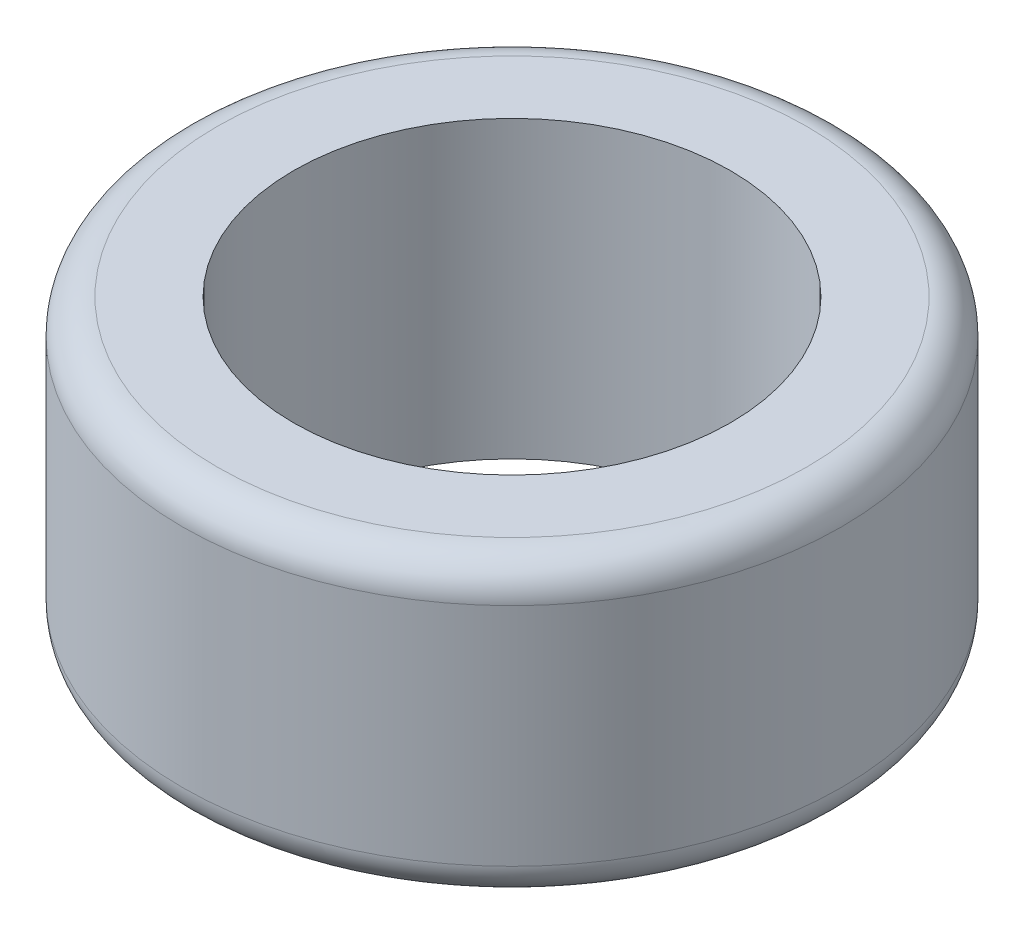
ISO-10303-21;
HEADER;
FILE_DESCRIPTION(('STEP AP214'),'2;1');
FILE_NAME('part.step','',(''),(''),'','','');
FILE_SCHEMA(('AUTOMOTIVE_DESIGN { 1 0 10303 214 1 1 1 1 }'));
ENDSEC;
DATA;
#1=APPLICATION_CONTEXT('core data for automotive mechanical design processes');
#2=APPLICATION_PROTOCOL_DEFINITION('international standard','automotive_design',2000,#1);
#3=PRODUCT_CONTEXT('',#1,'mechanical');
#4=PRODUCT('Part','Part','',(#3));
#5=PRODUCT_RELATED_PRODUCT_CATEGORY('part','',(#4));
#6=PRODUCT_DEFINITION_FORMATION('','',#4);
#7=PRODUCT_DEFINITION_CONTEXT('part definition',#1,'design');
#8=PRODUCT_DEFINITION('design','',#6,#7);
#9=PRODUCT_DEFINITION_SHAPE('','',#8);
#10=(LENGTH_UNIT() NAMED_UNIT(*) SI_UNIT(.MILLI.,.METRE.));
#11=(NAMED_UNIT(*) PLANE_ANGLE_UNIT() SI_UNIT($,.RADIAN.));
#12=(NAMED_UNIT(*) SI_UNIT($,.STERADIAN.) SOLID_ANGLE_UNIT());
#13=UNCERTAINTY_MEASURE_WITH_UNIT(LENGTH_MEASURE(1.E-05),#10,'distance_accuracy_value','');
#14=(GEOMETRIC_REPRESENTATION_CONTEXT(3) GLOBAL_UNCERTAINTY_ASSIGNED_CONTEXT((#13)) GLOBAL_UNIT_ASSIGNED_CONTEXT((#10,
#11,#12)) REPRESENTATION_CONTEXT('',''));
#15=CARTESIAN_POINT('',(0.,0.,0.));
#16=DIRECTION('',(0.,0.,1.));
#17=DIRECTION('',(1.,0.,0.));
#18=AXIS2_PLACEMENT_3D('',#15,#16,#17);
#19=CARTESIAN_POINT('',(-152.4,0.,0.));
#20=DIRECTION('',(0.,1.,0.));
#21=DIRECTION('',(0.,0.,1.));
#22=AXIS2_PLACEMENT_3D('',#19,#20,#21);
#23=PLANE('',#22);
#24=CARTESIAN_POINT('',(0.,0.,0.));
#25=DIRECTION('',(0.,-1.,0.));
#26=DIRECTION('',(0.,0.,-1.));
#27=AXIS2_PLACEMENT_3D('',#24,#25,#26);
#28=CIRCLE('',#27,152.4);
#29=CARTESIAN_POINT('',(0.,0.,-152.4));
#30=VERTEX_POINT('',#29);
#31=EDGE_CURVE('E10',#30,#30,#28,.T.);
#32=ORIENTED_EDGE('',*,*,#31,.F.);
#33=EDGE_LOOP('',(#32));
#34=FACE_BOUND('',#33,.T.);
#35=CARTESIAN_POINT('',(0.,0.,0.));
#36=DIRECTION('',(0.,-1.,0.));
#37=DIRECTION('',(0.,0.,-1.));
#38=AXIS2_PLACEMENT_3D('',#35,#36,#37);
#39=CIRCLE('',#38,205.74);
#40=CARTESIAN_POINT('',(0.,0.,-205.74));
#41=VERTEX_POINT('',#40);
#42=EDGE_CURVE('E61',#41,#41,#39,.T.);
#43=ORIENTED_EDGE('',*,*,#42,.T.);
#44=EDGE_LOOP('',(#43));
#45=FACE_BOUND('',#44,.T.);
#46=ADVANCED_FACE('F39',(#34,#45),#23,.F.);
#47=CARTESIAN_POINT('',(0.,0.,0.));
#48=DIRECTION('',(0.,-1.,0.));
#49=DIRECTION('',(0.,0.,-1.));
#50=AXIS2_PLACEMENT_3D('',#47,#48,#49);
#51=CYLINDRICAL_SURFACE('',#50,152.4);
#52=CARTESIAN_POINT('',(0.,205.74,0.));
#53=DIRECTION('',(0.,-1.,0.));
#54=DIRECTION('',(0.,0.,-1.));
#55=AXIS2_PLACEMENT_3D('',#52,#53,#54);
#56=CIRCLE('',#55,152.4);
#57=CARTESIAN_POINT('',(0.,205.74,-152.4));
#58=VERTEX_POINT('',#57);
#59=EDGE_CURVE('E45',#58,#58,#56,.T.);
#60=ORIENTED_EDGE('',*,*,#59,.F.);
#61=EDGE_LOOP('',(#60));
#62=FACE_BOUND('',#61,.T.);
#63=ORIENTED_EDGE('',*,*,#31,.T.);
#64=EDGE_LOOP('',(#63));
#65=FACE_BOUND('',#64,.T.);
#66=ADVANCED_FACE('F86',(#62,#65),#51,.F.);
#67=CARTESIAN_POINT('',(-152.4,205.74,0.));
#68=DIRECTION('',(0.,-1.,0.));
#69=DIRECTION('',(0.,0.,-1.));
#70=AXIS2_PLACEMENT_3D('',#67,#68,#69);
#71=PLANE('',#70);
#72=CARTESIAN_POINT('',(0.,205.74,0.));
#73=DIRECTION('',(0.,-1.,0.));
#74=DIRECTION('',(0.,0.,-1.));
#75=AXIS2_PLACEMENT_3D('',#72,#73,#74);
#76=CIRCLE('',#75,205.74);
#77=CARTESIAN_POINT('',(0.,205.74,-205.74));
#78=VERTEX_POINT('',#77);
#79=EDGE_CURVE('E49',#78,#78,#76,.T.);
#80=ORIENTED_EDGE('',*,*,#79,.F.);
#81=EDGE_LOOP('',(#80));
#82=FACE_BOUND('',#81,.T.);
#83=ORIENTED_EDGE('',*,*,#59,.T.);
#84=EDGE_LOOP('',(#83));
#85=FACE_BOUND('',#84,.T.);
#86=ADVANCED_FACE('F81',(#82,#85),#71,.F.);
#87=CARTESIAN_POINT('',(0.,181.61,0.));
#88=DIRECTION('',(0.,-1.,0.));
#89=DIRECTION('',(0.,0.,-1.));
#90=AXIS2_PLACEMENT_3D('',#87,#88,#89);
#91=TOROIDAL_SURFACE('',#90,205.74,24.13);
#92=CARTESIAN_POINT('',(0.,181.61,0.));
#93=DIRECTION('',(0.,-1.,0.));
#94=DIRECTION('',(0.,0.,-1.));
#95=AXIS2_PLACEMENT_3D('',#92,#93,#94);
#96=CIRCLE('',#95,229.87);
#97=CARTESIAN_POINT('',(0.,181.61,-229.87));
#98=VERTEX_POINT('',#97);
#99=EDGE_CURVE('E53',#98,#98,#96,.T.);
#100=ORIENTED_EDGE('',*,*,#99,.F.);
#101=EDGE_LOOP('',(#100));
#102=FACE_BOUND('',#101,.T.);
#103=ORIENTED_EDGE('',*,*,#79,.T.);
#104=EDGE_LOOP('',(#103));
#105=FACE_BOUND('',#104,.T.);
#106=ADVANCED_FACE('F75',(#102,#105),#91,.T.);
#107=CARTESIAN_POINT('',(0.,0.,0.));
#108=DIRECTION('',(0.,-1.,0.));
#109=DIRECTION('',(0.,0.,-1.));
#110=AXIS2_PLACEMENT_3D('',#107,#108,#109);
#111=CYLINDRICAL_SURFACE('',#110,229.87);
#112=CARTESIAN_POINT('',(0.,24.13,0.));
#113=DIRECTION('',(0.,-1.,0.));
#114=DIRECTION('',(0.,0.,-1.));
#115=AXIS2_PLACEMENT_3D('',#112,#113,#114);
#116=CIRCLE('',#115,229.87);
#117=CARTESIAN_POINT('',(0.,24.13,-229.87));
#118=VERTEX_POINT('',#117);
#119=EDGE_CURVE('E58',#118,#118,#116,.T.);
#120=ORIENTED_EDGE('',*,*,#119,.F.);
#121=EDGE_LOOP('',(#120));
#122=FACE_BOUND('',#121,.T.);
#123=ORIENTED_EDGE('',*,*,#99,.T.);
#124=EDGE_LOOP('',(#123));
#125=FACE_BOUND('',#124,.T.);
#126=ADVANCED_FACE('F69',(#122,#125),#111,.T.);
#127=CARTESIAN_POINT('',(0.,24.13,0.));
#128=DIRECTION('',(0.,-1.,0.));
#129=DIRECTION('',(0.,0.,-1.));
#130=AXIS2_PLACEMENT_3D('',#127,#128,#129);
#131=TOROIDAL_SURFACE('',#130,205.74,24.13);
#132=ORIENTED_EDGE('',*,*,#42,.F.);
#133=EDGE_LOOP('',(#132));
#134=FACE_BOUND('',#133,.T.);
#135=ORIENTED_EDGE('',*,*,#119,.T.);
#136=EDGE_LOOP('',(#135));
#137=FACE_BOUND('',#136,.T.);
#138=ADVANCED_FACE('F66',(#134,#137),#131,.T.);
#139=CLOSED_SHELL('',(#46,#66,#86,#106,#126,#138));
#140=MANIFOLD_SOLID_BREP('B2',#139);
#141=ADVANCED_BREP_SHAPE_REPRESENTATION('',(#18,#140),#14);
#142=SHAPE_DEFINITION_REPRESENTATION(#9,#141);
ENDSEC;
END-ISO-10303-21;
